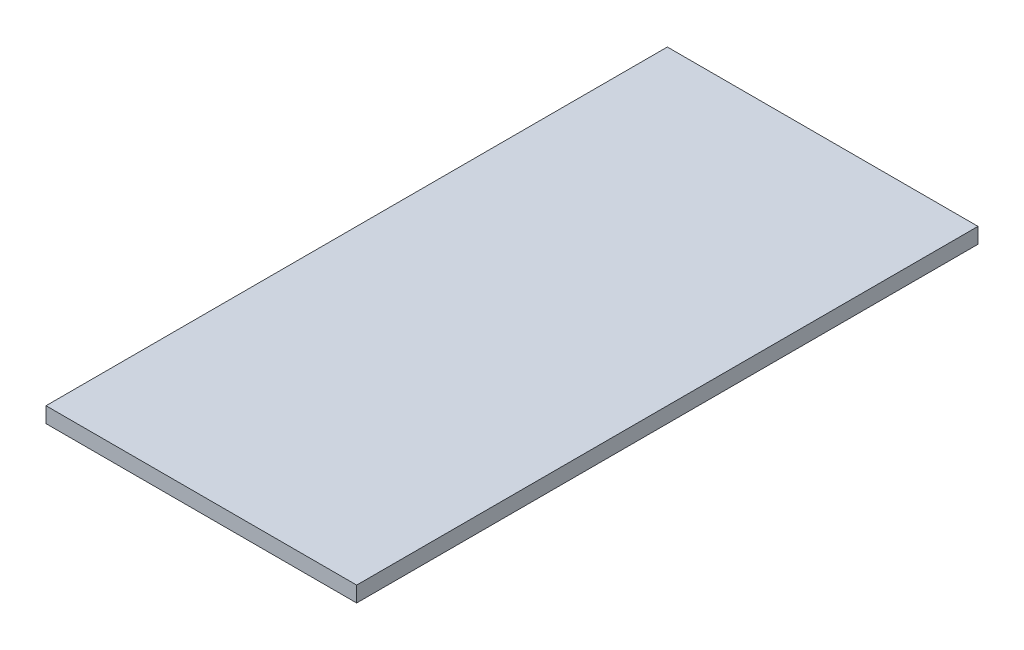
ISO-10303-21;
HEADER;
FILE_DESCRIPTION(('STEP AP214'),'2;1');
FILE_NAME('part.step','',(''),(''),'','','');
FILE_SCHEMA(('AUTOMOTIVE_DESIGN { 1 0 10303 214 1 1 1 1 }'));
ENDSEC;
DATA;
#1=APPLICATION_CONTEXT('core data for automotive mechanical design processes');
#2=APPLICATION_PROTOCOL_DEFINITION('international standard','automotive_design',2000,#1);
#3=PRODUCT_CONTEXT('',#1,'mechanical');
#4=PRODUCT('Part','Part','',(#3));
#5=PRODUCT_RELATED_PRODUCT_CATEGORY('part','',(#4));
#6=PRODUCT_DEFINITION_FORMATION('','',#4);
#7=PRODUCT_DEFINITION_CONTEXT('part definition',#1,'design');
#8=PRODUCT_DEFINITION('design','',#6,#7);
#9=PRODUCT_DEFINITION_SHAPE('','',#8);
#10=(LENGTH_UNIT() NAMED_UNIT(*) SI_UNIT(.MILLI.,.METRE.));
#11=(NAMED_UNIT(*) PLANE_ANGLE_UNIT() SI_UNIT($,.RADIAN.));
#12=(NAMED_UNIT(*) SI_UNIT($,.STERADIAN.) SOLID_ANGLE_UNIT());
#13=UNCERTAINTY_MEASURE_WITH_UNIT(LENGTH_MEASURE(1.E-05),#10,'distance_accuracy_value','');
#14=(GEOMETRIC_REPRESENTATION_CONTEXT(3) GLOBAL_UNCERTAINTY_ASSIGNED_CONTEXT((#13)) GLOBAL_UNIT_ASSIGNED_CONTEXT((#10,
#11,#12)) REPRESENTATION_CONTEXT('',''));
#15=CARTESIAN_POINT('',(0.,0.,0.));
#16=DIRECTION('',(0.,0.,1.));
#17=DIRECTION('',(1.,0.,0.));
#18=AXIS2_PLACEMENT_3D('',#15,#16,#17);
#19=CARTESIAN_POINT('',(0.,2.54,0.));
#20=DIRECTION('',(1.,0.,0.));
#21=DIRECTION('',(0.,0.,-1.));
#22=AXIS2_PLACEMENT_3D('',#19,#20,#21);
#23=PLANE('',#22);
#24=DIRECTION('',(0.,0.,1.));
#25=VECTOR('',#24,1.);
#26=CARTESIAN_POINT('',(0.,0.,0.));
#27=LINE('',#26,#25);
#28=CARTESIAN_POINT('',(0.,0.,-101.6));
#29=VERTEX_POINT('',#28);
#30=CARTESIAN_POINT('',(0.,0.,0.));
#31=VERTEX_POINT('',#30);
#32=EDGE_CURVE('E100',#29,#31,#27,.T.);
#33=ORIENTED_EDGE('',*,*,#32,.T.);
#34=DIRECTION('',(0.,-1.,0.));
#35=VECTOR('',#34,1.);
#36=CARTESIAN_POINT('',(0.,2.54,0.));
#37=LINE('',#36,#35);
#38=CARTESIAN_POINT('',(0.,2.54,0.));
#39=VERTEX_POINT('',#38);
#40=EDGE_CURVE('E11',#39,#31,#37,.T.);
#41=ORIENTED_EDGE('',*,*,#40,.F.);
#42=DIRECTION('',(0.,0.,1.));
#43=VECTOR('',#42,1.);
#44=CARTESIAN_POINT('',(0.,2.54,0.));
#45=LINE('',#44,#43);
#46=CARTESIAN_POINT('',(0.,2.54,-101.6));
#47=VERTEX_POINT('',#46);
#48=EDGE_CURVE('E88',#47,#39,#45,.T.);
#49=ORIENTED_EDGE('',*,*,#48,.F.);
#50=DIRECTION('',(0.,-1.,0.));
#51=VECTOR('',#50,1.);
#52=CARTESIAN_POINT('',(0.,2.54,-101.6));
#53=LINE('',#52,#51);
#54=EDGE_CURVE('E96',#47,#29,#53,.T.);
#55=ORIENTED_EDGE('',*,*,#54,.T.);
#56=EDGE_LOOP('',(#33,#41,#49,#55));
#57=FACE_BOUND('',#56,.T.);
#58=ADVANCED_FACE('F37',(#57),#23,.F.);
#59=CARTESIAN_POINT('',(0.,2.54,0.));
#60=DIRECTION('',(0.,0.,-1.));
#61=DIRECTION('',(-1.,0.,0.));
#62=AXIS2_PLACEMENT_3D('',#59,#60,#61);
#63=PLANE('',#62);
#64=DIRECTION('',(1.,0.,0.));
#65=VECTOR('',#64,1.);
#66=CARTESIAN_POINT('',(0.,0.,0.));
#67=LINE('',#66,#65);
#68=CARTESIAN_POINT('',(50.8,0.,0.));
#69=VERTEX_POINT('',#68);
#70=EDGE_CURVE('E92',#31,#69,#67,.T.);
#71=ORIENTED_EDGE('',*,*,#70,.T.);
#72=DIRECTION('',(0.,-1.,0.));
#73=VECTOR('',#72,1.);
#74=CARTESIAN_POINT('',(50.8,2.54,0.));
#75=LINE('',#74,#73);
#76=CARTESIAN_POINT('',(50.8,2.54,0.));
#77=VERTEX_POINT('',#76);
#78=EDGE_CURVE('E45',#77,#69,#75,.T.);
#79=ORIENTED_EDGE('',*,*,#78,.F.);
#80=DIRECTION('',(1.,0.,0.));
#81=VECTOR('',#80,1.);
#82=CARTESIAN_POINT('',(0.,2.54,0.));
#83=LINE('',#82,#81);
#84=EDGE_CURVE('E83',#39,#77,#83,.T.);
#85=ORIENTED_EDGE('',*,*,#84,.F.);
#86=ORIENTED_EDGE('',*,*,#40,.T.);
#87=EDGE_LOOP('',(#71,#79,#85,#86));
#88=FACE_BOUND('',#87,.T.);
#89=ADVANCED_FACE('F91',(#88),#63,.F.);
#90=CARTESIAN_POINT('',(50.8,2.54,0.));
#91=DIRECTION('',(-1.,0.,0.));
#92=DIRECTION('',(0.,0.,1.));
#93=AXIS2_PLACEMENT_3D('',#90,#91,#92);
#94=PLANE('',#93);
#95=DIRECTION('',(0.,0.,-1.));
#96=VECTOR('',#95,1.);
#97=CARTESIAN_POINT('',(50.8,0.,0.));
#98=LINE('',#97,#96);
#99=CARTESIAN_POINT('',(50.8,0.,-101.6));
#100=VERTEX_POINT('',#99);
#101=EDGE_CURVE('E70',#69,#100,#98,.T.);
#102=ORIENTED_EDGE('',*,*,#101,.T.);
#103=DIRECTION('',(0.,-1.,0.));
#104=VECTOR('',#103,1.);
#105=CARTESIAN_POINT('',(50.8,2.54,-101.6));
#106=LINE('',#105,#104);
#107=CARTESIAN_POINT('',(50.8,2.54,-101.6));
#108=VERTEX_POINT('',#107);
#109=EDGE_CURVE('E93',#108,#100,#106,.T.);
#110=ORIENTED_EDGE('',*,*,#109,.F.);
#111=DIRECTION('',(0.,0.,-1.));
#112=VECTOR('',#111,1.);
#113=CARTESIAN_POINT('',(50.8,2.54,0.));
#114=LINE('',#113,#112);
#115=EDGE_CURVE('E86',#77,#108,#114,.T.);
#116=ORIENTED_EDGE('',*,*,#115,.F.);
#117=ORIENTED_EDGE('',*,*,#78,.T.);
#118=EDGE_LOOP('',(#102,#110,#116,#117));
#119=FACE_BOUND('',#118,.T.);
#120=ADVANCED_FACE('F94',(#119),#94,.F.);
#121=CARTESIAN_POINT('',(0.,2.54,-101.6));
#122=DIRECTION('',(0.,0.,1.));
#123=DIRECTION('',(1.,0.,0.));
#124=AXIS2_PLACEMENT_3D('',#121,#122,#123);
#125=PLANE('',#124);
#126=DIRECTION('',(-1.,0.,0.));
#127=VECTOR('',#126,1.);
#128=CARTESIAN_POINT('',(0.,0.,-101.6));
#129=LINE('',#128,#127);
#130=EDGE_CURVE('E76',#100,#29,#129,.T.);
#131=ORIENTED_EDGE('',*,*,#130,.T.);
#132=ORIENTED_EDGE('',*,*,#54,.F.);
#133=DIRECTION('',(-1.,0.,0.));
#134=VECTOR('',#133,1.);
#135=CARTESIAN_POINT('',(0.,2.54,-101.6));
#136=LINE('',#135,#134);
#137=EDGE_CURVE('E53',#108,#47,#136,.T.);
#138=ORIENTED_EDGE('',*,*,#137,.F.);
#139=ORIENTED_EDGE('',*,*,#109,.T.);
#140=EDGE_LOOP('',(#131,#132,#138,#139));
#141=FACE_BOUND('',#140,.T.);
#142=ADVANCED_FACE('F107',(#141),#125,.F.);
#143=CARTESIAN_POINT('',(0.,2.54,0.));
#144=DIRECTION('',(0.,-1.,0.));
#145=DIRECTION('',(0.,0.,-1.));
#146=AXIS2_PLACEMENT_3D('',#143,#144,#145);
#147=PLANE('',#146);
#148=ORIENTED_EDGE('',*,*,#48,.T.);
#149=ORIENTED_EDGE('',*,*,#84,.T.);
#150=ORIENTED_EDGE('',*,*,#115,.T.);
#151=ORIENTED_EDGE('',*,*,#137,.T.);
#152=EDGE_LOOP('',(#148,#149,#150,#151));
#153=FACE_BOUND('',#152,.T.);
#154=ADVANCED_FACE('F84',(#153),#147,.F.);
#155=CARTESIAN_POINT('',(0.,0.,0.));
#156=DIRECTION('',(0.,-1.,0.));
#157=DIRECTION('',(0.,0.,-1.));
#158=AXIS2_PLACEMENT_3D('',#155,#156,#157);
#159=PLANE('',#158);
#160=ORIENTED_EDGE('',*,*,#32,.F.);
#161=ORIENTED_EDGE('',*,*,#130,.F.);
#162=ORIENTED_EDGE('',*,*,#101,.F.);
#163=ORIENTED_EDGE('',*,*,#70,.F.);
#164=EDGE_LOOP('',(#160,#161,#162,#163));
#165=FACE_BOUND('',#164,.T.);
#166=ADVANCED_FACE('F110',(#165),#159,.T.);
#167=CLOSED_SHELL('',(#58,#89,#120,#142,#154,#166));
#168=MANIFOLD_SOLID_BREP('B2',#167);
#169=ADVANCED_BREP_SHAPE_REPRESENTATION('',(#18,#168),#14);
#170=SHAPE_DEFINITION_REPRESENTATION(#9,#169);
ENDSEC;
END-ISO-10303-21;
